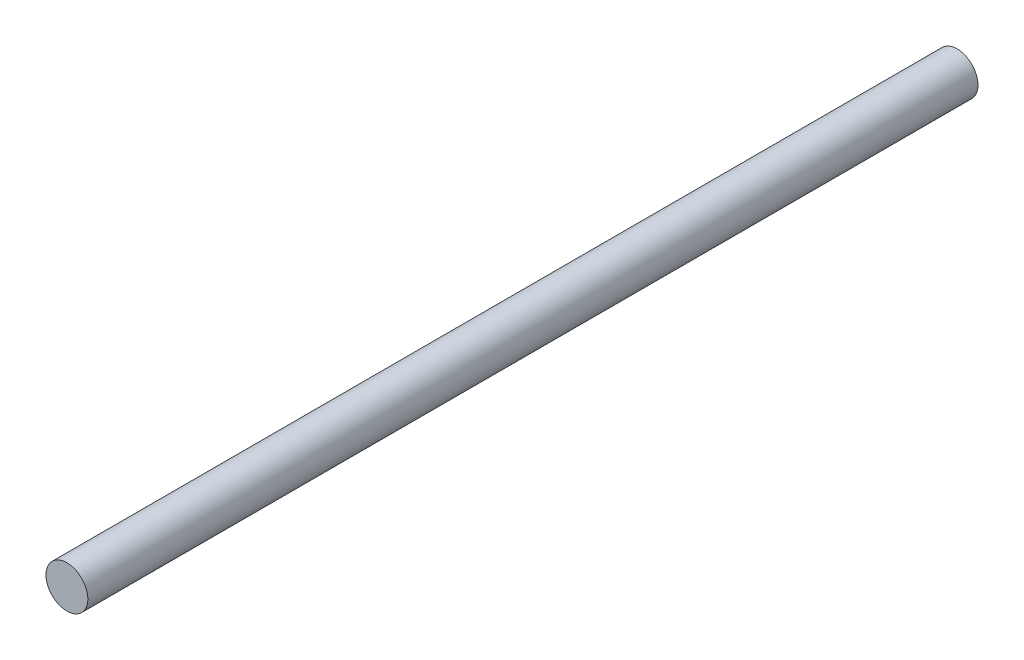
ISO-10303-21;
HEADER;
FILE_DESCRIPTION(('STEP AP214'),'2;1');
FILE_NAME('part.step','',(''),(''),'','','');
FILE_SCHEMA(('AUTOMOTIVE_DESIGN { 1 0 10303 214 1 1 1 1 }'));
ENDSEC;
DATA;
#1=APPLICATION_CONTEXT('core data for automotive mechanical design processes');
#2=APPLICATION_PROTOCOL_DEFINITION('international standard','automotive_design',2000,#1);
#3=PRODUCT_CONTEXT('',#1,'mechanical');
#4=PRODUCT('Part','Part','',(#3));
#5=PRODUCT_RELATED_PRODUCT_CATEGORY('part','',(#4));
#6=PRODUCT_DEFINITION_FORMATION('','',#4);
#7=PRODUCT_DEFINITION_CONTEXT('part definition',#1,'design');
#8=PRODUCT_DEFINITION('design','',#6,#7);
#9=PRODUCT_DEFINITION_SHAPE('','',#8);
#10=(LENGTH_UNIT() NAMED_UNIT(*) SI_UNIT(.MILLI.,.METRE.));
#11=(NAMED_UNIT(*) PLANE_ANGLE_UNIT() SI_UNIT($,.RADIAN.));
#12=(NAMED_UNIT(*) SI_UNIT($,.STERADIAN.) SOLID_ANGLE_UNIT());
#13=UNCERTAINTY_MEASURE_WITH_UNIT(LENGTH_MEASURE(1.E-05),#10,'distance_accuracy_value','');
#14=(GEOMETRIC_REPRESENTATION_CONTEXT(3) GLOBAL_UNCERTAINTY_ASSIGNED_CONTEXT((#13)) GLOBAL_UNIT_ASSIGNED_CONTEXT((#10,
#11,#12)) REPRESENTATION_CONTEXT('',''));
#15=CARTESIAN_POINT('',(0.,0.,0.));
#16=DIRECTION('',(0.,0.,1.));
#17=DIRECTION('',(1.,0.,0.));
#18=AXIS2_PLACEMENT_3D('',#15,#16,#17);
#19=CARTESIAN_POINT('',(0.,0.,255.));
#20=DIRECTION('',(0.,0.,-1.));
#21=DIRECTION('',(-1.,0.,0.));
#22=AXIS2_PLACEMENT_3D('',#19,#20,#21);
#23=CYLINDRICAL_SURFACE('',#22,6.);
#24=CARTESIAN_POINT('',(0.,0.,255.));
#25=DIRECTION('',(0.,0.,1.));
#26=DIRECTION('',(1.,0.,0.));
#27=AXIS2_PLACEMENT_3D('',#24,#25,#26);
#28=CIRCLE('',#27,6.);
#29=CARTESIAN_POINT('',(6.,0.,255.));
#30=VERTEX_POINT('',#29);
#31=EDGE_CURVE('E10',#30,#30,#28,.T.);
#32=ORIENTED_EDGE('',*,*,#31,.F.);
#33=EDGE_LOOP('',(#32));
#34=FACE_BOUND('',#33,.T.);
#35=CARTESIAN_POINT('',(0.,0.,0.));
#36=DIRECTION('',(0.,0.,1.));
#37=DIRECTION('',(1.,0.,0.));
#38=AXIS2_PLACEMENT_3D('',#35,#36,#37);
#39=CIRCLE('',#38,6.);
#40=CARTESIAN_POINT('',(6.,0.,0.));
#41=VERTEX_POINT('',#40);
#42=EDGE_CURVE('E37',#41,#41,#39,.T.);
#43=ORIENTED_EDGE('',*,*,#42,.T.);
#44=EDGE_LOOP('',(#43));
#45=FACE_BOUND('',#44,.T.);
#46=ADVANCED_FACE('F40',(#34,#45),#23,.T.);
#47=CARTESIAN_POINT('',(0.,0.,255.));
#48=DIRECTION('',(0.,0.,1.));
#49=DIRECTION('',(1.,0.,0.));
#50=AXIS2_PLACEMENT_3D('',#47,#48,#49);
#51=PLANE('',#50);
#52=ORIENTED_EDGE('',*,*,#31,.T.);
#53=EDGE_LOOP('',(#52));
#54=FACE_BOUND('',#53,.T.);
#55=ADVANCED_FACE('F55',(#54),#51,.T.);
#56=CARTESIAN_POINT('',(0.,0.,0.));
#57=DIRECTION('',(0.,0.,1.));
#58=DIRECTION('',(1.,0.,0.));
#59=AXIS2_PLACEMENT_3D('',#56,#57,#58);
#60=PLANE('',#59);
#61=ORIENTED_EDGE('',*,*,#42,.F.);
#62=EDGE_LOOP('',(#61));
#63=FACE_BOUND('',#62,.T.);
#64=ADVANCED_FACE('F49',(#63),#60,.F.);
#65=CLOSED_SHELL('',(#46,#55,#64));
#66=MANIFOLD_SOLID_BREP('B2',#65);
#67=ADVANCED_BREP_SHAPE_REPRESENTATION('',(#18,#66),#14);
#68=SHAPE_DEFINITION_REPRESENTATION(#9,#67);
ENDSEC;
END-ISO-10303-21;
